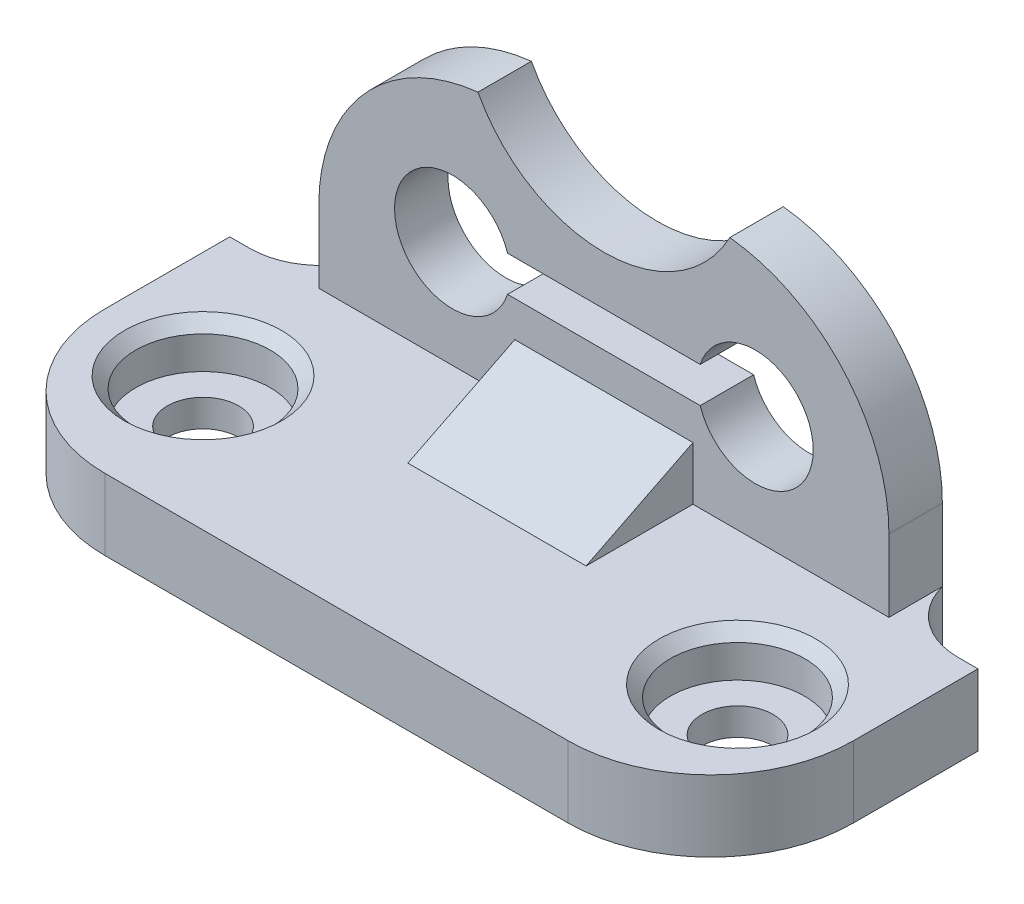
ISO-10303-21;
HEADER;
FILE_DESCRIPTION(('STEP AP214'),'2;1');
FILE_NAME('part.step','',(''),(''),'','','');
FILE_SCHEMA(('AUTOMOTIVE_DESIGN { 1 0 10303 214 1 1 1 1 }'));
ENDSEC;
DATA;
#1=APPLICATION_CONTEXT('core data for automotive mechanical design processes');
#2=APPLICATION_PROTOCOL_DEFINITION('international standard','automotive_design',2000,#1);
#3=PRODUCT_CONTEXT('',#1,'mechanical');
#4=PRODUCT('Part','Part','',(#3));
#5=PRODUCT_RELATED_PRODUCT_CATEGORY('part','',(#4));
#6=PRODUCT_DEFINITION_FORMATION('','',#4);
#7=PRODUCT_DEFINITION_CONTEXT('part definition',#1,'design');
#8=PRODUCT_DEFINITION('design','',#6,#7);
#9=PRODUCT_DEFINITION_SHAPE('','',#8);
#10=(LENGTH_UNIT() NAMED_UNIT(*) SI_UNIT(.MILLI.,.METRE.));
#11=(NAMED_UNIT(*) PLANE_ANGLE_UNIT() SI_UNIT($,.RADIAN.));
#12=(NAMED_UNIT(*) SI_UNIT($,.STERADIAN.) SOLID_ANGLE_UNIT());
#13=UNCERTAINTY_MEASURE_WITH_UNIT(LENGTH_MEASURE(1.E-05),#10,'distance_accuracy_value','');
#14=(GEOMETRIC_REPRESENTATION_CONTEXT(3) GLOBAL_UNCERTAINTY_ASSIGNED_CONTEXT((#13)) GLOBAL_UNIT_ASSIGNED_CONTEXT((#10,
#11,#12)) REPRESENTATION_CONTEXT('',''));
#15=CARTESIAN_POINT('',(0.,0.,0.));
#16=DIRECTION('',(0.,0.,1.));
#17=DIRECTION('',(1.,0.,0.));
#18=AXIS2_PLACEMENT_3D('',#15,#16,#17);
#19=CARTESIAN_POINT('',(21.,-5.,3.));
#20=DIRECTION('',(0.,-1.,0.));
#21=DIRECTION('',(0.,0.,-1.));
#22=AXIS2_PLACEMENT_3D('',#19,#20,#21);
#23=PLANE('',#22);
#24=CARTESIAN_POINT('',(15.,-5.,10.5));
#25=DIRECTION('',(0.,1.,0.));
#26=DIRECTION('',(0.,0.,1.));
#27=AXIS2_PLACEMENT_3D('',#24,#25,#26);
#28=CIRCLE('',#27,4.40563);
#29=CARTESIAN_POINT('',(15.,-5.,14.90563));
#30=VERTEX_POINT('',#29);
#31=EDGE_CURVE('E233',#30,#30,#28,.T.);
#32=ORIENTED_EDGE('',*,*,#31,.F.);
#33=EDGE_LOOP('',(#32));
#34=FACE_BOUND('',#33,.T.);
#35=DIRECTION('',(-1.,0.,0.));
#36=VECTOR('',#35,1.);
#37=CARTESIAN_POINT('',(21.,-5.,3.));
#38=LINE('',#37,#36);
#39=CARTESIAN_POINT('',(16.0000275912928,-5.,3.));
#40=VERTEX_POINT('',#39);
#41=CARTESIAN_POINT('',(5.,-5.,3.));
#42=VERTEX_POINT('',#41);
#43=EDGE_CURVE('E296',#40,#42,#38,.T.);
#44=ORIENTED_EDGE('',*,*,#43,.T.);
#45=DIRECTION('',(0.,0.,1.));
#46=VECTOR('',#45,1.);
#47=CARTESIAN_POINT('',(5.,-5.,3.));
#48=LINE('',#47,#46);
#49=CARTESIAN_POINT('',(5.,-5.,9.00000000000001));
#50=VERTEX_POINT('',#49);
#51=EDGE_CURVE('E213',#42,#50,#48,.T.);
#52=ORIENTED_EDGE('',*,*,#51,.T.);
#53=DIRECTION('',(-1.,0.,0.));
#54=VECTOR('',#53,1.);
#55=CARTESIAN_POINT('',(21.,-5.,9.00000000000001));
#56=LINE('',#55,#54);
#57=CARTESIAN_POINT('',(-5.,-5.,9.00000000000001));
#58=VERTEX_POINT('',#57);
#59=EDGE_CURVE('E204',#50,#58,#56,.T.);
#60=ORIENTED_EDGE('',*,*,#59,.T.);
#61=DIRECTION('',(0.,0.,1.));
#62=VECTOR('',#61,1.);
#63=CARTESIAN_POINT('',(-5.,-5.,3.));
#64=LINE('',#63,#62);
#65=CARTESIAN_POINT('',(-5.,-5.,3.));
#66=VERTEX_POINT('',#65);
#67=EDGE_CURVE('E188',#66,#58,#64,.T.);
#68=ORIENTED_EDGE('',*,*,#67,.F.);
#69=CARTESIAN_POINT('',(-16.0000275912928,-5.,3.));
#70=VERTEX_POINT('',#69);
#71=EDGE_CURVE('E397',#66,#70,#38,.T.);
#72=ORIENTED_EDGE('',*,*,#71,.T.);
#73=DIRECTION('',(0.,0.,1.));
#74=VECTOR('',#73,1.);
#75=CARTESIAN_POINT('',(-16.0000275912928,-5.,3.));
#76=LINE('',#75,#74);
#77=CARTESIAN_POINT('',(-16.0000275912928,-5.,0.));
#78=VERTEX_POINT('',#77);
#79=EDGE_CURVE('E436',#78,#70,#76,.T.);
#80=ORIENTED_EDGE('',*,*,#79,.F.);
#81=CARTESIAN_POINT('',(-19.8730109375002,-4.99999999999999,-0.999999999999999));
#82=DIRECTION('',(0.,-1.,0.));
#83=DIRECTION('',(0.,0.,-1.));
#84=AXIS2_PLACEMENT_3D('',#81,#82,#83);
#85=CIRCLE('',#84,4.);
#86=CARTESIAN_POINT('',(-19.8730109375002,-5.,3.));
#87=VERTEX_POINT('',#86);
#88=EDGE_CURVE('E50',#78,#87,#85,.T.);
#89=ORIENTED_EDGE('',*,*,#88,.T.);
#90=CARTESIAN_POINT('',(-21.,-5.,3.));
#91=VERTEX_POINT('',#90);
#92=EDGE_CURVE('E290',#87,#91,#38,.T.);
#93=ORIENTED_EDGE('',*,*,#92,.T.);
#94=DIRECTION('',(0.,0.,1.));
#95=VECTOR('',#94,1.);
#96=CARTESIAN_POINT('',(-21.,-5.,3.));
#97=LINE('',#96,#95);
#98=CARTESIAN_POINT('',(-21.,-5.,10.));
#99=VERTEX_POINT('',#98);
#100=EDGE_CURVE('E271',#91,#99,#97,.T.);
#101=ORIENTED_EDGE('',*,*,#100,.T.);
#102=CARTESIAN_POINT('',(-13.,-5.,10.));
#103=DIRECTION('',(0.,-1.,0.));
#104=DIRECTION('',(0.,0.,-1.));
#105=AXIS2_PLACEMENT_3D('',#102,#103,#104);
#106=CIRCLE('',#105,8.);
#107=CARTESIAN_POINT('',(-13.,-5.,18.));
#108=VERTEX_POINT('',#107);
#109=EDGE_CURVE('E415',#99,#108,#106,.F.);
#110=ORIENTED_EDGE('',*,*,#109,.T.);
#111=DIRECTION('',(-1.,0.,0.));
#112=VECTOR('',#111,1.);
#113=CARTESIAN_POINT('',(21.,-5.,18.));
#114=LINE('',#113,#112);
#115=CARTESIAN_POINT('',(13.,-5.,18.));
#116=VERTEX_POINT('',#115);
#117=EDGE_CURVE('E286',#116,#108,#114,.T.);
#118=ORIENTED_EDGE('',*,*,#117,.F.);
#119=CARTESIAN_POINT('',(13.,-5.,10.));
#120=DIRECTION('',(0.,-1.,0.));
#121=DIRECTION('',(0.,0.,-1.));
#122=AXIS2_PLACEMENT_3D('',#119,#120,#121);
#123=CIRCLE('',#122,8.);
#124=CARTESIAN_POINT('',(21.,-5.,10.));
#125=VERTEX_POINT('',#124);
#126=EDGE_CURVE('E418',#116,#125,#123,.F.);
#127=ORIENTED_EDGE('',*,*,#126,.T.);
#128=DIRECTION('',(0.,0.,1.));
#129=VECTOR('',#128,1.);
#130=CARTESIAN_POINT('',(21.,-5.,3.));
#131=LINE('',#130,#129);
#132=CARTESIAN_POINT('',(21.,-5.,3.));
#133=VERTEX_POINT('',#132);
#134=EDGE_CURVE('E259',#133,#125,#131,.T.);
#135=ORIENTED_EDGE('',*,*,#134,.F.);
#136=CARTESIAN_POINT('',(19.8730109375002,-5.,3.));
#137=VERTEX_POINT('',#136);
#138=EDGE_CURVE('E291',#133,#137,#38,.T.);
#139=ORIENTED_EDGE('',*,*,#138,.T.);
#140=CARTESIAN_POINT('',(19.8730109375002,-4.99999999999999,-0.999999999999999));
#141=DIRECTION('',(0.,-1.,0.));
#142=DIRECTION('',(0.,0.,-1.));
#143=AXIS2_PLACEMENT_3D('',#140,#141,#142);
#144=CIRCLE('',#143,4.);
#145=CARTESIAN_POINT('',(16.0000275912928,-4.99999999999999,0.));
#146=VERTEX_POINT('',#145);
#147=EDGE_CURVE('E442',#137,#146,#144,.T.);
#148=ORIENTED_EDGE('',*,*,#147,.T.);
#149=DIRECTION('',(0.,0.,-1.));
#150=VECTOR('',#149,1.);
#151=CARTESIAN_POINT('',(16.0000275912928,-5.,3.));
#152=LINE('',#151,#150);
#153=EDGE_CURVE('E57',#40,#146,#152,.T.);
#154=ORIENTED_EDGE('',*,*,#153,.F.);
#155=EDGE_LOOP('',(#44,#52,#60,#68,#72,#80,#89,#93,#101,#110,#118,#127,#135,#139,#148,#154));
#156=FACE_BOUND('',#155,.T.);
#157=CARTESIAN_POINT('',(-15.,-5.,10.5));
#158=DIRECTION('',(0.,1.,0.));
#159=DIRECTION('',(0.,0.,1.));
#160=AXIS2_PLACEMENT_3D('',#157,#158,#159);
#161=CIRCLE('',#160,4.40563);
#162=CARTESIAN_POINT('',(-15.,-5.,14.90563));
#163=VERTEX_POINT('',#162);
#164=EDGE_CURVE('E215',#163,#163,#161,.T.);
#165=ORIENTED_EDGE('',*,*,#164,.F.);
#166=EDGE_LOOP('',(#165));
#167=FACE_BOUND('',#166,.T.);
#168=ADVANCED_FACE('F41',(#34,#156,#167),#23,.F.);
#169=CARTESIAN_POINT('',(-8.5,0.999999999999998,3.));
#170=DIRECTION('',(0.,0.,-1.));
#171=DIRECTION('',(-1.,0.,0.));
#172=AXIS2_PLACEMENT_3D('',#169,#170,#171);
#173=CYLINDRICAL_SURFACE('',#172,3.25);
#174=CARTESIAN_POINT('',(-8.5,0.999999999999998,0.));
#175=DIRECTION('',(0.,0.,1.));
#176=DIRECTION('',(1.,0.,0.));
#177=AXIS2_PLACEMENT_3D('',#174,#175,#176);
#178=CIRCLE('',#177,3.25);
#179=CARTESIAN_POINT('',(-5.40767078078675,2.,0.));
#180=VERTEX_POINT('',#179);
#181=CARTESIAN_POINT('',(-5.40767078078675,0.,0.));
#182=VERTEX_POINT('',#181);
#183=EDGE_CURVE('E332',#180,#182,#178,.T.);
#184=ORIENTED_EDGE('',*,*,#183,.F.);
#185=DIRECTION('',(0.,0.,-1.));
#186=VECTOR('',#185,1.);
#187=CARTESIAN_POINT('',(-5.40767078078675,2.,3.));
#188=LINE('',#187,#186);
#189=CARTESIAN_POINT('',(-5.40767078078675,2.,3.));
#190=VERTEX_POINT('',#189);
#191=EDGE_CURVE('E321',#180,#190,#188,.F.);
#192=ORIENTED_EDGE('',*,*,#191,.T.);
#193=CARTESIAN_POINT('',(-8.5,0.999999999999998,3.));
#194=DIRECTION('',(0.,0.,1.));
#195=DIRECTION('',(1.,0.,0.));
#196=AXIS2_PLACEMENT_3D('',#193,#194,#195);
#197=CIRCLE('',#196,3.25);
#198=CARTESIAN_POINT('',(-5.40767078078675,0.,3.));
#199=VERTEX_POINT('',#198);
#200=EDGE_CURVE('E333',#190,#199,#197,.T.);
#201=ORIENTED_EDGE('',*,*,#200,.T.);
#202=DIRECTION('',(0.,0.,-1.));
#203=VECTOR('',#202,1.);
#204=CARTESIAN_POINT('',(-5.40767078078675,0.,3.));
#205=LINE('',#204,#203);
#206=EDGE_CURVE('E315',#182,#199,#205,.F.);
#207=ORIENTED_EDGE('',*,*,#206,.F.);
#208=EDGE_LOOP('',(#184,#192,#201,#207));
#209=FACE_BOUND('',#208,.T.);
#210=ADVANCED_FACE('F545',(#209),#173,.F.);
#211=CARTESIAN_POINT('',(8.5,1.,3.));
#212=DIRECTION('',(0.,0.,-1.));
#213=DIRECTION('',(-1.,0.,0.));
#214=AXIS2_PLACEMENT_3D('',#211,#212,#213);
#215=CYLINDRICAL_SURFACE('',#214,3.25);
#216=DIRECTION('',(0.,0.,-1.));
#217=VECTOR('',#216,1.);
#218=CARTESIAN_POINT('',(5.40767078078675,2.,3.));
#219=LINE('',#218,#217);
#220=CARTESIAN_POINT('',(5.40767078078675,2.,0.));
#221=VERTEX_POINT('',#220);
#222=CARTESIAN_POINT('',(5.40767078078675,2.,3.));
#223=VERTEX_POINT('',#222);
#224=EDGE_CURVE('E318',#221,#223,#219,.F.);
#225=ORIENTED_EDGE('',*,*,#224,.F.);
#226=CARTESIAN_POINT('',(8.5,1.,0.));
#227=DIRECTION('',(0.,0.,1.));
#228=DIRECTION('',(1.,0.,0.));
#229=AXIS2_PLACEMENT_3D('',#226,#227,#228);
#230=CIRCLE('',#229,3.25);
#231=CARTESIAN_POINT('',(5.40767078078675,0.,0.));
#232=VERTEX_POINT('',#231);
#233=EDGE_CURVE('E338',#221,#232,#230,.F.);
#234=ORIENTED_EDGE('',*,*,#233,.T.);
#235=DIRECTION('',(0.,0.,-1.));
#236=VECTOR('',#235,1.);
#237=CARTESIAN_POINT('',(5.40767078078675,0.,3.));
#238=LINE('',#237,#236);
#239=CARTESIAN_POINT('',(5.40767078078675,0.,3.));
#240=VERTEX_POINT('',#239);
#241=EDGE_CURVE('E301',#232,#240,#238,.F.);
#242=ORIENTED_EDGE('',*,*,#241,.T.);
#243=CARTESIAN_POINT('',(8.5,1.,3.));
#244=DIRECTION('',(0.,0.,1.));
#245=DIRECTION('',(1.,0.,0.));
#246=AXIS2_PLACEMENT_3D('',#243,#244,#245);
#247=CIRCLE('',#246,3.25);
#248=EDGE_CURVE('E344',#223,#240,#247,.F.);
#249=ORIENTED_EDGE('',*,*,#248,.F.);
#250=EDGE_LOOP('',(#225,#234,#242,#249));
#251=FACE_BOUND('',#250,.T.);
#252=ADVANCED_FACE('F551',(#251),#215,.F.);
#253=CARTESIAN_POINT('',(0.,0.,3.));
#254=DIRECTION('',(0.,0.,1.));
#255=DIRECTION('',(1.,0.,0.));
#256=AXIS2_PLACEMENT_3D('',#253,#254,#255);
#257=PLANE('',#256);
#258=DIRECTION('',(0.,1.,0.));
#259=VECTOR('',#258,1.);
#260=CARTESIAN_POINT('',(5.,0.,3.));
#261=LINE('',#260,#259);
#262=CARTESIAN_POINT('',(5.,-2.,3.));
#263=VERTEX_POINT('',#262);
#264=EDGE_CURVE('E199',#42,#263,#261,.T.);
#265=ORIENTED_EDGE('',*,*,#264,.F.);
#266=ORIENTED_EDGE('',*,*,#43,.F.);
#267=DIRECTION('',(0.,1.,0.));
#268=VECTOR('',#267,1.);
#269=CARTESIAN_POINT('',(16.0000275912928,0.,3.));
#270=LINE('',#269,#268);
#271=CARTESIAN_POINT('',(16.0000275912928,-0.942801986017521,3.));
#272=VERTEX_POINT('',#271);
#273=EDGE_CURVE('E337',#40,#272,#270,.T.);
#274=ORIENTED_EDGE('',*,*,#273,.T.);
#275=CARTESIAN_POINT('',(6.00002759129282,-0.942801986017521,3.));
#276=DIRECTION('',(0.,0.,1.));
#277=DIRECTION('',(1.,0.,0.));
#278=AXIS2_PLACEMENT_3D('',#275,#276,#277);
#279=CIRCLE('',#278,10.);
#280=CARTESIAN_POINT('',(7.06805786560436,9.,3.));
#281=VERTEX_POINT('',#280);
#282=EDGE_CURVE('E390',#272,#281,#279,.T.);
#283=ORIENTED_EDGE('',*,*,#282,.T.);
#284=CARTESIAN_POINT('',(0.,12.7473401244707,3.));
#285=DIRECTION('',(0.,0.,1.));
#286=DIRECTION('',(1.,0.,0.));
#287=AXIS2_PLACEMENT_3D('',#284,#285,#286);
#288=CIRCLE('',#287,8.);
#289=CARTESIAN_POINT('',(-7.06805786560436,9.,3.));
#290=VERTEX_POINT('',#289);
#291=EDGE_CURVE('E302',#290,#281,#288,.T.);
#292=ORIENTED_EDGE('',*,*,#291,.F.);
#293=CARTESIAN_POINT('',(-6.00002759129281,-0.942801986017521,3.));
#294=DIRECTION('',(0.,0.,1.));
#295=DIRECTION('',(1.,0.,0.));
#296=AXIS2_PLACEMENT_3D('',#293,#294,#295);
#297=CIRCLE('',#296,10.);
#298=CARTESIAN_POINT('',(-16.0000275912928,-0.942801986017517,3.));
#299=VERTEX_POINT('',#298);
#300=EDGE_CURVE('E386',#290,#299,#297,.T.);
#301=ORIENTED_EDGE('',*,*,#300,.T.);
#302=DIRECTION('',(0.,1.,0.));
#303=VECTOR('',#302,1.);
#304=CARTESIAN_POINT('',(-16.0000275912928,0.,3.));
#305=LINE('',#304,#303);
#306=EDGE_CURVE('E341',#70,#299,#305,.T.);
#307=ORIENTED_EDGE('',*,*,#306,.F.);
#308=ORIENTED_EDGE('',*,*,#71,.F.);
#309=DIRECTION('',(0.,1.,0.));
#310=VECTOR('',#309,1.);
#311=CARTESIAN_POINT('',(-5.,0.,3.));
#312=LINE('',#311,#310);
#313=CARTESIAN_POINT('',(-5.,-2.,3.));
#314=VERTEX_POINT('',#313);
#315=EDGE_CURVE('E194',#66,#314,#312,.T.);
#316=ORIENTED_EDGE('',*,*,#315,.T.);
#317=DIRECTION('',(-1.,0.,0.));
#318=VECTOR('',#317,1.);
#319=CARTESIAN_POINT('',(0.,-2.,3.));
#320=LINE('',#319,#318);
#321=EDGE_CURVE('E207',#263,#314,#320,.T.);
#322=ORIENTED_EDGE('',*,*,#321,.F.);
#323=EDGE_LOOP('',(#265,#266,#274,#283,#292,#301,#307,#308,#316,#322));
#324=FACE_BOUND('',#323,.T.);
#325=ORIENTED_EDGE('',*,*,#200,.F.);
#326=DIRECTION('',(1.,0.,0.));
#327=VECTOR('',#326,1.);
#328=CARTESIAN_POINT('',(-7.5,2.,3.));
#329=LINE('',#328,#327);
#330=EDGE_CURVE('E295',#190,#223,#329,.T.);
#331=ORIENTED_EDGE('',*,*,#330,.T.);
#332=ORIENTED_EDGE('',*,*,#248,.T.);
#333=DIRECTION('',(1.,0.,0.));
#334=VECTOR('',#333,1.);
#335=CARTESIAN_POINT('',(-7.5,0.,3.));
#336=LINE('',#335,#334);
#337=EDGE_CURVE('E306',#199,#240,#336,.T.);
#338=ORIENTED_EDGE('',*,*,#337,.F.);
#339=EDGE_LOOP('',(#325,#331,#332,#338));
#340=FACE_BOUND('',#339,.T.);
#341=ADVANCED_FACE('F514',(#324,#340),#257,.T.);
#342=CARTESIAN_POINT('',(0.,0.,0.));
#343=DIRECTION('',(0.,0.,1.));
#344=DIRECTION('',(1.,0.,0.));
#345=AXIS2_PLACEMENT_3D('',#342,#343,#344);
#346=PLANE('',#345);
#347=DIRECTION('',(-1.,0.,0.));
#348=VECTOR('',#347,1.);
#349=CARTESIAN_POINT('',(0.,-9.,0.));
#350=LINE('',#349,#348);
#351=CARTESIAN_POINT('',(16.0000275912928,-9.,0.));
#352=VERTEX_POINT('',#351);
#353=CARTESIAN_POINT('',(-16.0000275912928,-9.,0.));
#354=VERTEX_POINT('',#353);
#355=EDGE_CURVE('E352',#352,#354,#350,.T.);
#356=ORIENTED_EDGE('',*,*,#355,.T.);
#357=DIRECTION('',(0.,1.,0.));
#358=VECTOR('',#357,1.);
#359=CARTESIAN_POINT('',(-16.0000275912928,0.,0.));
#360=LINE('',#359,#358);
#361=EDGE_CURVE('E362',#354,#78,#360,.T.);
#362=ORIENTED_EDGE('',*,*,#361,.T.);
#363=CARTESIAN_POINT('',(-16.0000275912928,-0.942801986017517,0.));
#364=VERTEX_POINT('',#363);
#365=EDGE_CURVE('E361',#78,#364,#360,.T.);
#366=ORIENTED_EDGE('',*,*,#365,.T.);
#367=CARTESIAN_POINT('',(-6.00002759129281,-0.942801986017521,0.));
#368=DIRECTION('',(0.,0.,1.));
#369=DIRECTION('',(1.,0.,0.));
#370=AXIS2_PLACEMENT_3D('',#367,#368,#369);
#371=CIRCLE('',#370,10.);
#372=CARTESIAN_POINT('',(-7.06805786560436,9.,0.));
#373=VERTEX_POINT('',#372);
#374=EDGE_CURVE('E375',#364,#373,#371,.F.);
#375=ORIENTED_EDGE('',*,*,#374,.T.);
#376=CARTESIAN_POINT('',(0.,12.7473401244707,0.));
#377=DIRECTION('',(0.,0.,1.));
#378=DIRECTION('',(1.,0.,0.));
#379=AXIS2_PLACEMENT_3D('',#376,#377,#378);
#380=CIRCLE('',#379,8.);
#381=CARTESIAN_POINT('',(7.06805786560436,9.,0.));
#382=VERTEX_POINT('',#381);
#383=EDGE_CURVE('E297',#373,#382,#380,.T.);
#384=ORIENTED_EDGE('',*,*,#383,.T.);
#385=CARTESIAN_POINT('',(6.00002759129282,-0.942801986017521,0.));
#386=DIRECTION('',(0.,0.,1.));
#387=DIRECTION('',(1.,0.,0.));
#388=AXIS2_PLACEMENT_3D('',#385,#386,#387);
#389=CIRCLE('',#388,10.);
#390=CARTESIAN_POINT('',(16.0000275912928,-0.942801986017521,0.));
#391=VERTEX_POINT('',#390);
#392=EDGE_CURVE('E378',#382,#391,#389,.F.);
#393=ORIENTED_EDGE('',*,*,#392,.T.);
#394=DIRECTION('',(0.,1.,0.));
#395=VECTOR('',#394,1.);
#396=CARTESIAN_POINT('',(16.0000275912928,0.,0.));
#397=LINE('',#396,#395);
#398=EDGE_CURVE('E356',#146,#391,#397,.T.);
#399=ORIENTED_EDGE('',*,*,#398,.F.);
#400=EDGE_CURVE('E357',#352,#146,#397,.T.);
#401=ORIENTED_EDGE('',*,*,#400,.F.);
#402=EDGE_LOOP('',(#356,#362,#366,#375,#384,#393,#399,#401));
#403=FACE_BOUND('',#402,.T.);
#404=DIRECTION('',(1.,0.,0.));
#405=VECTOR('',#404,1.);
#406=CARTESIAN_POINT('',(0.,2.,0.));
#407=LINE('',#406,#405);
#408=EDGE_CURVE('E372',#180,#221,#407,.T.);
#409=ORIENTED_EDGE('',*,*,#408,.F.);
#410=ORIENTED_EDGE('',*,*,#183,.T.);
#411=DIRECTION('',(1.,0.,0.));
#412=VECTOR('',#411,1.);
#413=CARTESIAN_POINT('',(0.,0.,0.));
#414=LINE('',#413,#412);
#415=EDGE_CURVE('E348',#182,#232,#414,.T.);
#416=ORIENTED_EDGE('',*,*,#415,.T.);
#417=ORIENTED_EDGE('',*,*,#233,.F.);
#418=EDGE_LOOP('',(#409,#410,#416,#417));
#419=FACE_BOUND('',#418,.T.);
#420=ADVANCED_FACE('F496',(#403,#419),#346,.F.);
#421=CARTESIAN_POINT('',(0.,-9.,3.));
#422=DIRECTION('',(0.,-1.,0.));
#423=DIRECTION('',(0.,0.,-1.));
#424=AXIS2_PLACEMENT_3D('',#421,#422,#423);
#425=PLANE('',#424);
#426=DIRECTION('',(-1.,0.,0.));
#427=VECTOR('',#426,1.);
#428=CARTESIAN_POINT('',(21.,-9.,3.));
#429=LINE('',#428,#427);
#430=CARTESIAN_POINT('',(-19.8730109375002,-9.,3.));
#431=VERTEX_POINT('',#430);
#432=CARTESIAN_POINT('',(-21.,-9.,3.));
#433=VERTEX_POINT('',#432);
#434=EDGE_CURVE('E267',#431,#433,#429,.T.);
#435=ORIENTED_EDGE('',*,*,#434,.F.);
#436=CARTESIAN_POINT('',(-19.8730109375002,-9.,-0.999999999999999));
#437=DIRECTION('',(0.,-1.,0.));
#438=DIRECTION('',(0.,0.,-1.));
#439=AXIS2_PLACEMENT_3D('',#436,#437,#438);
#440=CIRCLE('',#439,4.);
#441=EDGE_CURVE('E11',#431,#354,#440,.F.);
#442=ORIENTED_EDGE('',*,*,#441,.T.);
#443=ORIENTED_EDGE('',*,*,#355,.F.);
#444=CARTESIAN_POINT('',(19.8730109375002,-9.,-0.999999999999999));
#445=DIRECTION('',(0.,-1.,0.));
#446=DIRECTION('',(0.,0.,-1.));
#447=AXIS2_PLACEMENT_3D('',#444,#445,#446);
#448=CIRCLE('',#447,4.);
#449=CARTESIAN_POINT('',(19.8730109375002,-9.,3.));
#450=VERTEX_POINT('',#449);
#451=EDGE_CURVE('E445',#352,#450,#448,.F.);
#452=ORIENTED_EDGE('',*,*,#451,.T.);
#453=CARTESIAN_POINT('',(21.,-9.,3.));
#454=VERTEX_POINT('',#453);
#455=EDGE_CURVE('E278',#454,#450,#429,.T.);
#456=ORIENTED_EDGE('',*,*,#455,.F.);
#457=DIRECTION('',(0.,0.,-1.));
#458=VECTOR('',#457,1.);
#459=CARTESIAN_POINT('',(21.,-9.,3.));
#460=LINE('',#459,#458);
#461=CARTESIAN_POINT('',(21.,-9.,10.));
#462=VERTEX_POINT('',#461);
#463=EDGE_CURVE('E264',#462,#454,#460,.T.);
#464=ORIENTED_EDGE('',*,*,#463,.F.);
#465=CARTESIAN_POINT('',(13.,-9.,10.));
#466=DIRECTION('',(0.,-1.,0.));
#467=DIRECTION('',(0.,0.,-1.));
#468=AXIS2_PLACEMENT_3D('',#465,#466,#467);
#469=CIRCLE('',#468,8.);
#470=CARTESIAN_POINT('',(13.,-9.,18.));
#471=VERTEX_POINT('',#470);
#472=EDGE_CURVE('E405',#462,#471,#469,.T.);
#473=ORIENTED_EDGE('',*,*,#472,.T.);
#474=DIRECTION('',(-1.,0.,0.));
#475=VECTOR('',#474,1.);
#476=CARTESIAN_POINT('',(21.,-9.,18.));
#477=LINE('',#476,#475);
#478=CARTESIAN_POINT('',(-13.,-9.,18.));
#479=VERTEX_POINT('',#478);
#480=EDGE_CURVE('E282',#471,#479,#477,.T.);
#481=ORIENTED_EDGE('',*,*,#480,.T.);
#482=CARTESIAN_POINT('',(-13.,-9.,10.));
#483=DIRECTION('',(0.,-1.,0.));
#484=DIRECTION('',(0.,0.,-1.));
#485=AXIS2_PLACEMENT_3D('',#482,#483,#484);
#486=CIRCLE('',#485,8.);
#487=CARTESIAN_POINT('',(-21.,-9.,10.));
#488=VERTEX_POINT('',#487);
#489=EDGE_CURVE('E402',#479,#488,#486,.T.);
#490=ORIENTED_EDGE('',*,*,#489,.T.);
#491=DIRECTION('',(0.,0.,-1.));
#492=VECTOR('',#491,1.);
#493=CARTESIAN_POINT('',(-21.,-9.,3.));
#494=LINE('',#493,#492);
#495=EDGE_CURVE('E260',#488,#433,#494,.T.);
#496=ORIENTED_EDGE('',*,*,#495,.T.);
#497=EDGE_LOOP('',(#435,#442,#443,#452,#456,#464,#473,#481,#490,#496));
#498=FACE_BOUND('',#497,.T.);
#499=CARTESIAN_POINT('',(-15.,-9.,10.5));
#500=DIRECTION('',(0.,-1.,0.));
#501=DIRECTION('',(0.,0.,-1.));
#502=AXIS2_PLACEMENT_3D('',#499,#500,#501);
#503=CIRCLE('',#502,2.);
#504=CARTESIAN_POINT('',(-15.,-9.,8.49999999999999));
#505=VERTEX_POINT('',#504);
#506=EDGE_CURVE('E250',#505,#505,#503,.T.);
#507=ORIENTED_EDGE('',*,*,#506,.F.);
#508=EDGE_LOOP('',(#507));
#509=FACE_BOUND('',#508,.T.);
#510=CARTESIAN_POINT('',(15.,-9.,10.5));
#511=DIRECTION('',(0.,-1.,0.));
#512=DIRECTION('',(0.,0.,-1.));
#513=AXIS2_PLACEMENT_3D('',#510,#511,#512);
#514=CIRCLE('',#513,2.);
#515=CARTESIAN_POINT('',(15.,-9.,8.49999999999999));
#516=VERTEX_POINT('',#515);
#517=EDGE_CURVE('E246',#516,#516,#514,.T.);
#518=ORIENTED_EDGE('',*,*,#517,.F.);
#519=EDGE_LOOP('',(#518));
#520=FACE_BOUND('',#519,.T.);
#521=ADVANCED_FACE('F462',(#498,#509,#520),#425,.T.);
#522=CARTESIAN_POINT('',(16.0000275912928,0.,3.));
#523=DIRECTION('',(-1.,0.,0.));
#524=DIRECTION('',(0.,0.,1.));
#525=AXIS2_PLACEMENT_3D('',#522,#523,#524);
#526=PLANE('',#525);
#527=ORIENTED_EDGE('',*,*,#273,.F.);
#528=ORIENTED_EDGE('',*,*,#153,.T.);
#529=ORIENTED_EDGE('',*,*,#398,.T.);
#530=DIRECTION('',(0.,0.,1.));
#531=VECTOR('',#530,1.);
#532=CARTESIAN_POINT('',(16.0000275912928,-0.942801986017521,3.));
#533=LINE('',#532,#531);
#534=EDGE_CURVE('E382',#391,#272,#533,.T.);
#535=ORIENTED_EDGE('',*,*,#534,.T.);
#536=EDGE_LOOP('',(#527,#528,#529,#535));
#537=FACE_BOUND('',#536,.T.);
#538=ADVANCED_FACE('F524',(#537),#526,.F.);
#539=CARTESIAN_POINT('',(-16.0000275912928,0.,3.));
#540=DIRECTION('',(-1.,0.,0.));
#541=DIRECTION('',(0.,-1.,0.));
#542=AXIS2_PLACEMENT_3D('',#539,#540,#541);
#543=PLANE('',#542);
#544=ORIENTED_EDGE('',*,*,#365,.F.);
#545=ORIENTED_EDGE('',*,*,#79,.T.);
#546=ORIENTED_EDGE('',*,*,#306,.T.);
#547=DIRECTION('',(0.,0.,-1.));
#548=VECTOR('',#547,1.);
#549=CARTESIAN_POINT('',(-16.0000275912928,-0.942801986017517,0.));
#550=LINE('',#549,#548);
#551=EDGE_CURVE('E393',#299,#364,#550,.T.);
#552=ORIENTED_EDGE('',*,*,#551,.T.);
#553=EDGE_LOOP('',(#544,#545,#546,#552));
#554=FACE_BOUND('',#553,.T.);
#555=ADVANCED_FACE('F509',(#554),#543,.T.);
#556=CARTESIAN_POINT('',(-7.5,0.,0.));
#557=DIRECTION('',(0.,-1.,0.));
#558=DIRECTION('',(0.,0.,-1.));
#559=AXIS2_PLACEMENT_3D('',#556,#557,#558);
#560=PLANE('',#559);
#561=ORIENTED_EDGE('',*,*,#206,.T.);
#562=ORIENTED_EDGE('',*,*,#337,.T.);
#563=ORIENTED_EDGE('',*,*,#241,.F.);
#564=ORIENTED_EDGE('',*,*,#415,.F.);
#565=EDGE_LOOP('',(#561,#562,#563,#564));
#566=FACE_BOUND('',#565,.T.);
#567=ADVANCED_FACE('F563',(#566),#560,.F.);
#568=CARTESIAN_POINT('',(-7.5,2.,0.));
#569=DIRECTION('',(0.,-1.,0.));
#570=DIRECTION('',(0.,0.,-1.));
#571=AXIS2_PLACEMENT_3D('',#568,#569,#570);
#572=PLANE('',#571);
#573=ORIENTED_EDGE('',*,*,#408,.T.);
#574=ORIENTED_EDGE('',*,*,#224,.T.);
#575=ORIENTED_EDGE('',*,*,#330,.F.);
#576=ORIENTED_EDGE('',*,*,#191,.F.);
#577=EDGE_LOOP('',(#573,#574,#575,#576));
#578=FACE_BOUND('',#577,.T.);
#579=ADVANCED_FACE('F562',(#578),#572,.T.);
#580=CARTESIAN_POINT('',(0.,12.7473401244707,0.));
#581=DIRECTION('',(0.,0.,1.));
#582=DIRECTION('',(1.,0.,0.));
#583=AXIS2_PLACEMENT_3D('',#580,#581,#582);
#584=CYLINDRICAL_SURFACE('',#583,8.);
#585=DIRECTION('',(0.,0.,1.));
#586=VECTOR('',#585,1.);
#587=CARTESIAN_POINT('',(-7.06805786560436,9.,0.));
#588=LINE('',#587,#586);
#589=EDGE_CURVE('E329',#373,#290,#588,.T.);
#590=ORIENTED_EDGE('',*,*,#589,.T.);
#591=ORIENTED_EDGE('',*,*,#291,.T.);
#592=DIRECTION('',(0.,0.,1.));
#593=VECTOR('',#592,1.);
#594=CARTESIAN_POINT('',(7.06805786560436,9.,0.));
#595=LINE('',#594,#593);
#596=EDGE_CURVE('E325',#281,#382,#595,.F.);
#597=ORIENTED_EDGE('',*,*,#596,.T.);
#598=ORIENTED_EDGE('',*,*,#383,.F.);
#599=EDGE_LOOP('',(#590,#591,#597,#598));
#600=FACE_BOUND('',#599,.T.);
#601=ADVANCED_FACE('F519',(#600),#584,.F.);
#602=CARTESIAN_POINT('',(6.00002759129282,-0.942801986017521,0.));
#603=DIRECTION('',(0.,0.,1.));
#604=DIRECTION('',(1.,0.,0.));
#605=AXIS2_PLACEMENT_3D('',#602,#603,#604);
#606=CYLINDRICAL_SURFACE('',#605,10.);
#607=ORIENTED_EDGE('',*,*,#282,.F.);
#608=ORIENTED_EDGE('',*,*,#534,.F.);
#609=ORIENTED_EDGE('',*,*,#392,.F.);
#610=ORIENTED_EDGE('',*,*,#596,.F.);
#611=EDGE_LOOP('',(#607,#608,#609,#610));
#612=FACE_BOUND('',#611,.T.);
#613=ADVANCED_FACE('F521',(#612),#606,.T.);
#614=CARTESIAN_POINT('',(-6.00002759129281,-0.942801986017521,0.));
#615=DIRECTION('',(0.,0.,1.));
#616=DIRECTION('',(1.,0.,0.));
#617=AXIS2_PLACEMENT_3D('',#614,#615,#616);
#618=CYLINDRICAL_SURFACE('',#617,10.);
#619=ORIENTED_EDGE('',*,*,#300,.F.);
#620=ORIENTED_EDGE('',*,*,#589,.F.);
#621=ORIENTED_EDGE('',*,*,#374,.F.);
#622=ORIENTED_EDGE('',*,*,#551,.F.);
#623=EDGE_LOOP('',(#619,#620,#621,#622));
#624=FACE_BOUND('',#623,.T.);
#625=ADVANCED_FACE('F508',(#624),#618,.T.);
#626=CARTESIAN_POINT('',(21.,-9.,3.));
#627=DIRECTION('',(0.,0.,1.));
#628=DIRECTION('',(1.,0.,0.));
#629=AXIS2_PLACEMENT_3D('',#626,#627,#628);
#630=PLANE('',#629);
#631=ORIENTED_EDGE('',*,*,#455,.T.);
#632=DIRECTION('',(0.,1.,0.));
#633=VECTOR('',#632,1.);
#634=CARTESIAN_POINT('',(19.8730109375002,-9.,3.));
#635=LINE('',#634,#633);
#636=EDGE_CURVE('E424',#450,#137,#635,.T.);
#637=ORIENTED_EDGE('',*,*,#636,.T.);
#638=ORIENTED_EDGE('',*,*,#138,.F.);
#639=DIRECTION('',(0.,1.,0.));
#640=VECTOR('',#639,1.);
#641=CARTESIAN_POINT('',(21.,-9.,3.));
#642=LINE('',#641,#640);
#643=EDGE_CURVE('E255',#454,#133,#642,.T.);
#644=ORIENTED_EDGE('',*,*,#643,.F.);
#645=EDGE_LOOP('',(#631,#637,#638,#644));
#646=FACE_BOUND('',#645,.T.);
#647=ADVANCED_FACE('F488',(#646),#630,.F.);
#648=ORIENTED_EDGE('',*,*,#92,.F.);
#649=DIRECTION('',(0.,1.,0.));
#650=VECTOR('',#649,1.);
#651=CARTESIAN_POINT('',(-19.8730109375002,-8.99999999999998,3.));
#652=LINE('',#651,#650);
#653=EDGE_CURVE('E439',#87,#431,#652,.F.);
#654=ORIENTED_EDGE('',*,*,#653,.T.);
#655=ORIENTED_EDGE('',*,*,#434,.T.);
#656=DIRECTION('',(0.,1.,0.));
#657=VECTOR('',#656,1.);
#658=CARTESIAN_POINT('',(-21.,-9.,3.));
#659=LINE('',#658,#657);
#660=EDGE_CURVE('E254',#433,#91,#659,.T.);
#661=ORIENTED_EDGE('',*,*,#660,.T.);
#662=EDGE_LOOP('',(#648,#654,#655,#661));
#663=FACE_BOUND('',#662,.T.);
#664=ADVANCED_FACE('F456',(#663),#630,.F.);
#665=CARTESIAN_POINT('',(21.,-9.,18.));
#666=DIRECTION('',(0.,0.,-1.));
#667=DIRECTION('',(-1.,0.,0.));
#668=AXIS2_PLACEMENT_3D('',#665,#666,#667);
#669=PLANE('',#668);
#670=ORIENTED_EDGE('',*,*,#480,.F.);
#671=DIRECTION('',(0.,-1.,0.));
#672=VECTOR('',#671,1.);
#673=CARTESIAN_POINT('',(13.,-5.,18.));
#674=LINE('',#673,#672);
#675=EDGE_CURVE('E412',#471,#116,#674,.F.);
#676=ORIENTED_EDGE('',*,*,#675,.T.);
#677=ORIENTED_EDGE('',*,*,#117,.T.);
#678=DIRECTION('',(0.,-1.,0.));
#679=VECTOR('',#678,1.);
#680=CARTESIAN_POINT('',(-13.,-9.,18.));
#681=LINE('',#680,#679);
#682=EDGE_CURVE('E408',#108,#479,#681,.T.);
#683=ORIENTED_EDGE('',*,*,#682,.T.);
#684=EDGE_LOOP('',(#670,#676,#677,#683));
#685=FACE_BOUND('',#684,.T.);
#686=ADVANCED_FACE('F475',(#685),#669,.F.);
#687=CARTESIAN_POINT('',(21.,0.,0.));
#688=DIRECTION('',(1.,0.,0.));
#689=DIRECTION('',(0.,0.,-1.));
#690=AXIS2_PLACEMENT_3D('',#687,#688,#689);
#691=PLANE('',#690);
#692=ORIENTED_EDGE('',*,*,#134,.T.);
#693=DIRECTION('',(0.,-1.,0.));
#694=VECTOR('',#693,1.);
#695=CARTESIAN_POINT('',(21.,-9.,10.));
#696=LINE('',#695,#694);
#697=EDGE_CURVE('E398',#125,#462,#696,.T.);
#698=ORIENTED_EDGE('',*,*,#697,.T.);
#699=ORIENTED_EDGE('',*,*,#463,.T.);
#700=ORIENTED_EDGE('',*,*,#643,.T.);
#701=EDGE_LOOP('',(#692,#698,#699,#700));
#702=FACE_BOUND('',#701,.T.);
#703=ADVANCED_FACE('F484',(#702),#691,.T.);
#704=CARTESIAN_POINT('',(-21.,0.,0.));
#705=DIRECTION('',(1.,0.,0.));
#706=DIRECTION('',(0.,0.,-1.));
#707=AXIS2_PLACEMENT_3D('',#704,#705,#706);
#708=PLANE('',#707);
#709=ORIENTED_EDGE('',*,*,#495,.F.);
#710=DIRECTION('',(0.,-1.,0.));
#711=VECTOR('',#710,1.);
#712=CARTESIAN_POINT('',(-21.,0.,10.));
#713=LINE('',#712,#711);
#714=EDGE_CURVE('E421',#488,#99,#713,.F.);
#715=ORIENTED_EDGE('',*,*,#714,.T.);
#716=ORIENTED_EDGE('',*,*,#100,.F.);
#717=ORIENTED_EDGE('',*,*,#660,.F.);
#718=EDGE_LOOP('',(#709,#715,#716,#717));
#719=FACE_BOUND('',#718,.T.);
#720=ADVANCED_FACE('F467',(#719),#708,.F.);
#721=CARTESIAN_POINT('',(15.,-37.,10.5));
#722=DIRECTION('',(0.,1.,0.));
#723=DIRECTION('',(0.,0.,1.));
#724=AXIS2_PLACEMENT_3D('',#721,#722,#723);
#725=CYLINDRICAL_SURFACE('',#724,2.);
#726=CARTESIAN_POINT('',(15.,-7.4638,10.5));
#727=DIRECTION('',(0.,-1.,0.));
#728=DIRECTION('',(0.,0.,-1.));
#729=AXIS2_PLACEMENT_3D('',#726,#727,#728);
#730=CIRCLE('',#729,2.);
#731=CARTESIAN_POINT('',(15.,-7.4638,8.49999999999999));
#732=VERTEX_POINT('',#731);
#733=EDGE_CURVE('E245',#732,#732,#730,.F.);
#734=ORIENTED_EDGE('',*,*,#733,.T.);
#735=EDGE_LOOP('',(#734));
#736=FACE_BOUND('',#735,.T.);
#737=ORIENTED_EDGE('',*,*,#517,.T.);
#738=EDGE_LOOP('',(#737));
#739=FACE_BOUND('',#738,.T.);
#740=ADVANCED_FACE('F740',(#736,#739),#725,.F.);
#741=CARTESIAN_POINT('',(-15.,-37.,10.5));
#742=DIRECTION('',(0.,1.,0.));
#743=DIRECTION('',(0.,0.,1.));
#744=AXIS2_PLACEMENT_3D('',#741,#742,#743);
#745=CYLINDRICAL_SURFACE('',#744,2.);
#746=CARTESIAN_POINT('',(-15.,-7.4638,10.5));
#747=DIRECTION('',(0.,-1.,0.));
#748=DIRECTION('',(0.,0.,-1.));
#749=AXIS2_PLACEMENT_3D('',#746,#747,#748);
#750=CIRCLE('',#749,2.);
#751=CARTESIAN_POINT('',(-15.,-7.4638,8.49999999999999));
#752=VERTEX_POINT('',#751);
#753=EDGE_CURVE('E232',#752,#752,#750,.F.);
#754=ORIENTED_EDGE('',*,*,#753,.T.);
#755=EDGE_LOOP('',(#754));
#756=FACE_BOUND('',#755,.T.);
#757=ORIENTED_EDGE('',*,*,#506,.T.);
#758=EDGE_LOOP('',(#757));
#759=FACE_BOUND('',#758,.T.);
#760=ADVANCED_FACE('F589',(#756,#759),#745,.F.);
#761=CARTESIAN_POINT('',(13.,0.,10.));
#762=DIRECTION('',(0.,1.,0.));
#763=DIRECTION('',(0.,0.,1.));
#764=AXIS2_PLACEMENT_3D('',#761,#762,#763);
#765=CYLINDRICAL_SURFACE('',#764,8.);
#766=ORIENTED_EDGE('',*,*,#126,.F.);
#767=ORIENTED_EDGE('',*,*,#675,.F.);
#768=ORIENTED_EDGE('',*,*,#472,.F.);
#769=ORIENTED_EDGE('',*,*,#697,.F.);
#770=EDGE_LOOP('',(#766,#767,#768,#769));
#771=FACE_BOUND('',#770,.T.);
#772=ADVANCED_FACE('F482',(#771),#765,.T.);
#773=CARTESIAN_POINT('',(-13.,-9.,10.));
#774=DIRECTION('',(0.,-1.,0.));
#775=DIRECTION('',(0.,0.,-1.));
#776=AXIS2_PLACEMENT_3D('',#773,#774,#775);
#777=CYLINDRICAL_SURFACE('',#776,8.);
#778=ORIENTED_EDGE('',*,*,#109,.F.);
#779=ORIENTED_EDGE('',*,*,#714,.F.);
#780=ORIENTED_EDGE('',*,*,#489,.F.);
#781=ORIENTED_EDGE('',*,*,#682,.F.);
#782=EDGE_LOOP('',(#778,#779,#780,#781));
#783=FACE_BOUND('',#782,.T.);
#784=ADVANCED_FACE('F472',(#783),#777,.T.);
#785=CARTESIAN_POINT('',(18.77063,-7.4638,10.5));
#786=DIRECTION('',(0.,-1.,0.));
#787=DIRECTION('',(0.,0.,-1.));
#788=AXIS2_PLACEMENT_3D('',#785,#786,#787);
#789=PLANE('',#788);
#790=CARTESIAN_POINT('',(15.,-7.4638,10.5));
#791=DIRECTION('',(0.,1.,0.));
#792=DIRECTION('',(0.,0.,1.));
#793=AXIS2_PLACEMENT_3D('',#790,#791,#792);
#794=CIRCLE('',#793,3.77063);
#795=CARTESIAN_POINT('',(15.,-7.4638,14.27063));
#796=VERTEX_POINT('',#795);
#797=EDGE_CURVE('E241',#796,#796,#794,.T.);
#798=ORIENTED_EDGE('',*,*,#797,.T.);
#799=EDGE_LOOP('',(#798));
#800=FACE_BOUND('',#799,.T.);
#801=ORIENTED_EDGE('',*,*,#733,.F.);
#802=EDGE_LOOP('',(#801));
#803=FACE_BOUND('',#802,.T.);
#804=ADVANCED_FACE('F591',(#800,#803),#789,.F.);
#805=CARTESIAN_POINT('',(15.,-5.,10.5));
#806=DIRECTION('',(0.,1.,0.));
#807=DIRECTION('',(0.,0.,1.));
#808=AXIS2_PLACEMENT_3D('',#805,#806,#807);
#809=CYLINDRICAL_SURFACE('',#808,3.77063);
#810=ORIENTED_EDGE('',*,*,#797,.F.);
#811=EDGE_LOOP('',(#810));
#812=FACE_BOUND('',#811,.T.);
#813=CARTESIAN_POINT('',(15.,-5.635,10.5));
#814=DIRECTION('',(0.,1.,0.));
#815=DIRECTION('',(0.,0.,1.));
#816=AXIS2_PLACEMENT_3D('',#813,#814,#815);
#817=CIRCLE('',#816,3.77063);
#818=CARTESIAN_POINT('',(15.,-5.635,14.27063));
#819=VERTEX_POINT('',#818);
#820=EDGE_CURVE('E237',#819,#819,#817,.T.);
#821=ORIENTED_EDGE('',*,*,#820,.T.);
#822=EDGE_LOOP('',(#821));
#823=FACE_BOUND('',#822,.T.);
#824=ADVANCED_FACE('F713',(#812,#823),#809,.F.);
#825=CARTESIAN_POINT('',(15.,-5.,10.5));
#826=DIRECTION('',(0.,1.,0.));
#827=DIRECTION('',(0.,0.,1.));
#828=AXIS2_PLACEMENT_3D('',#825,#826,#827);
#829=CONICAL_SURFACE('',#828,4.40563,0.785398163397448);
#830=ORIENTED_EDGE('',*,*,#820,.F.);
#831=EDGE_LOOP('',(#830));
#832=FACE_BOUND('',#831,.T.);
#833=ORIENTED_EDGE('',*,*,#31,.T.);
#834=EDGE_LOOP('',(#833));
#835=FACE_BOUND('',#834,.T.);
#836=ADVANCED_FACE('F703',(#832,#835),#829,.F.);
#837=CARTESIAN_POINT('',(-11.22937,-7.4638,10.5));
#838=DIRECTION('',(0.,-1.,0.));
#839=DIRECTION('',(0.,0.,-1.));
#840=AXIS2_PLACEMENT_3D('',#837,#838,#839);
#841=PLANE('',#840);
#842=CARTESIAN_POINT('',(-15.,-7.4638,10.5));
#843=DIRECTION('',(0.,1.,0.));
#844=DIRECTION('',(0.,0.,1.));
#845=AXIS2_PLACEMENT_3D('',#842,#843,#844);
#846=CIRCLE('',#845,3.77063);
#847=CARTESIAN_POINT('',(-15.,-7.4638,14.27063));
#848=VERTEX_POINT('',#847);
#849=EDGE_CURVE('E228',#848,#848,#846,.T.);
#850=ORIENTED_EDGE('',*,*,#849,.T.);
#851=EDGE_LOOP('',(#850));
#852=FACE_BOUND('',#851,.T.);
#853=ORIENTED_EDGE('',*,*,#753,.F.);
#854=EDGE_LOOP('',(#853));
#855=FACE_BOUND('',#854,.T.);
#856=ADVANCED_FACE('F693',(#852,#855),#841,.F.);
#857=CARTESIAN_POINT('',(-15.,-5.,10.5));
#858=DIRECTION('',(0.,1.,0.));
#859=DIRECTION('',(0.,0.,1.));
#860=AXIS2_PLACEMENT_3D('',#857,#858,#859);
#861=CYLINDRICAL_SURFACE('',#860,3.77063);
#862=ORIENTED_EDGE('',*,*,#849,.F.);
#863=EDGE_LOOP('',(#862));
#864=FACE_BOUND('',#863,.T.);
#865=CARTESIAN_POINT('',(-15.,-5.635,10.5));
#866=DIRECTION('',(0.,1.,0.));
#867=DIRECTION('',(0.,0.,1.));
#868=AXIS2_PLACEMENT_3D('',#865,#866,#867);
#869=CIRCLE('',#868,3.77063);
#870=CARTESIAN_POINT('',(-15.,-5.635,14.27063));
#871=VERTEX_POINT('',#870);
#872=EDGE_CURVE('E220',#871,#871,#869,.T.);
#873=ORIENTED_EDGE('',*,*,#872,.T.);
#874=EDGE_LOOP('',(#873));
#875=FACE_BOUND('',#874,.T.);
#876=ADVANCED_FACE('F683',(#864,#875),#861,.F.);
#877=CARTESIAN_POINT('',(-15.,-5.,10.5));
#878=DIRECTION('',(0.,1.,0.));
#879=DIRECTION('',(0.,0.,1.));
#880=AXIS2_PLACEMENT_3D('',#877,#878,#879);
#881=CONICAL_SURFACE('',#880,4.40563,0.78539816339745);
#882=ORIENTED_EDGE('',*,*,#872,.F.);
#883=EDGE_LOOP('',(#882));
#884=FACE_BOUND('',#883,.T.);
#885=ORIENTED_EDGE('',*,*,#164,.T.);
#886=EDGE_LOOP('',(#885));
#887=FACE_BOUND('',#886,.T.);
#888=ADVANCED_FACE('F542',(#884,#887),#881,.F.);
#889=CARTESIAN_POINT('',(0.,-2.,3.));
#890=DIRECTION('',(0.,0.894427190999916,0.447213595499958));
#891=DIRECTION('',(0.,-0.447213595499958,0.894427190999916));
#892=AXIS2_PLACEMENT_3D('',#889,#890,#891);
#893=PLANE('',#892);
#894=ORIENTED_EDGE('',*,*,#59,.F.);
#895=DIRECTION('',(0.,-0.447213595499958,0.894427190999916));
#896=VECTOR('',#895,1.);
#897=CARTESIAN_POINT('',(5.,-2.,3.));
#898=LINE('',#897,#896);
#899=EDGE_CURVE('E209',#263,#50,#898,.T.);
#900=ORIENTED_EDGE('',*,*,#899,.F.);
#901=ORIENTED_EDGE('',*,*,#321,.T.);
#902=DIRECTION('',(0.,-0.447213595499958,0.894427190999916));
#903=VECTOR('',#902,1.);
#904=CARTESIAN_POINT('',(-5.,-2.,3.));
#905=LINE('',#904,#903);
#906=EDGE_CURVE('E191',#314,#58,#905,.T.);
#907=ORIENTED_EDGE('',*,*,#906,.T.);
#908=EDGE_LOOP('',(#894,#900,#901,#907));
#909=FACE_BOUND('',#908,.T.);
#910=ADVANCED_FACE('F202',(#909),#893,.T.);
#911=CARTESIAN_POINT('',(5.,0.,9.));
#912=DIRECTION('',(1.,0.,0.));
#913=DIRECTION('',(0.,0.,-1.));
#914=AXIS2_PLACEMENT_3D('',#911,#912,#913);
#915=PLANE('',#914);
#916=ORIENTED_EDGE('',*,*,#51,.F.);
#917=ORIENTED_EDGE('',*,*,#264,.T.);
#918=ORIENTED_EDGE('',*,*,#899,.T.);
#919=EDGE_LOOP('',(#916,#917,#918));
#920=FACE_BOUND('',#919,.T.);
#921=ADVANCED_FACE('F534',(#920),#915,.T.);
#922=CARTESIAN_POINT('',(-5.,0.,9.));
#923=DIRECTION('',(1.,0.,0.));
#924=DIRECTION('',(0.,0.,-1.));
#925=AXIS2_PLACEMENT_3D('',#922,#923,#924);
#926=PLANE('',#925);
#927=ORIENTED_EDGE('',*,*,#315,.F.);
#928=ORIENTED_EDGE('',*,*,#67,.T.);
#929=ORIENTED_EDGE('',*,*,#906,.F.);
#930=EDGE_LOOP('',(#927,#928,#929));
#931=FACE_BOUND('',#930,.T.);
#932=ADVANCED_FACE('F190',(#931),#926,.F.);
#933=CARTESIAN_POINT('',(19.8730109375002,0.,-0.999999999999999));
#934=DIRECTION('',(0.,1.,0.));
#935=DIRECTION('',(0.,0.,1.));
#936=AXIS2_PLACEMENT_3D('',#933,#934,#935);
#937=CYLINDRICAL_SURFACE('',#936,4.);
#938=ORIENTED_EDGE('',*,*,#451,.F.);
#939=ORIENTED_EDGE('',*,*,#400,.T.);
#940=ORIENTED_EDGE('',*,*,#147,.F.);
#941=ORIENTED_EDGE('',*,*,#636,.F.);
#942=EDGE_LOOP('',(#938,#939,#940,#941));
#943=FACE_BOUND('',#942,.T.);
#944=ADVANCED_FACE('F492',(#943),#937,.F.);
#945=CARTESIAN_POINT('',(-19.8730109375002,0.,-0.999999999999999));
#946=DIRECTION('',(0.,1.,0.));
#947=DIRECTION('',(-1.,0.,0.));
#948=AXIS2_PLACEMENT_3D('',#945,#946,#947);
#949=CYLINDRICAL_SURFACE('',#948,4.);
#950=ORIENTED_EDGE('',*,*,#441,.F.);
#951=ORIENTED_EDGE('',*,*,#653,.F.);
#952=ORIENTED_EDGE('',*,*,#88,.F.);
#953=ORIENTED_EDGE('',*,*,#361,.F.);
#954=EDGE_LOOP('',(#950,#951,#952,#953));
#955=FACE_BOUND('',#954,.T.);
#956=ADVANCED_FACE('F43',(#955),#949,.F.);
#957=CLOSED_SHELL('',(#168,#210,#252,#341,#420,#521,#538,#555,#567,#579,#601,#613,#625,#647,
#664,#686,#703,#720,#740,#760,#772,#784,#804,#824,#836,#856,#876,#888,#910,#921,#932,#944,#956));
#958=MANIFOLD_SOLID_BREP('B2',#957);
#959=ADVANCED_BREP_SHAPE_REPRESENTATION('',(#18,#958),#14);
#960=SHAPE_DEFINITION_REPRESENTATION(#9,#959);
ENDSEC;
END-ISO-10303-21;
